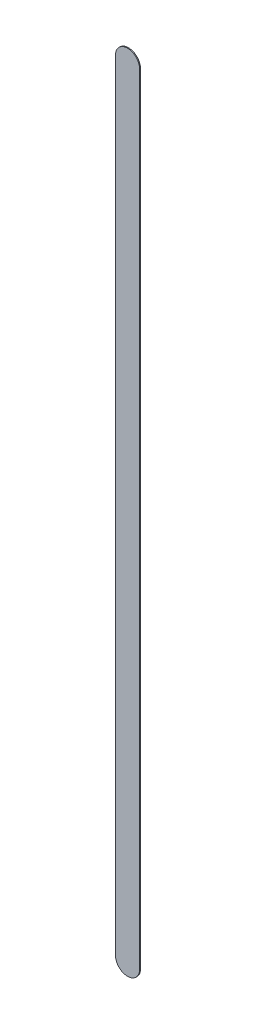
ISO-10303-21;
HEADER;
FILE_DESCRIPTION(('STEP AP214'),'2;1');
FILE_NAME('part.step','',(''),(''),'','','');
FILE_SCHEMA(('AUTOMOTIVE_DESIGN { 1 0 10303 214 1 1 1 1 }'));
ENDSEC;
DATA;
#1=APPLICATION_CONTEXT('core data for automotive mechanical design processes');
#2=APPLICATION_PROTOCOL_DEFINITION('international standard','automotive_design',2000,#1);
#3=PRODUCT_CONTEXT('',#1,'mechanical');
#4=PRODUCT('Part','Part','',(#3));
#5=PRODUCT_RELATED_PRODUCT_CATEGORY('part','',(#4));
#6=PRODUCT_DEFINITION_FORMATION('','',#4);
#7=PRODUCT_DEFINITION_CONTEXT('part definition',#1,'design');
#8=PRODUCT_DEFINITION('design','',#6,#7);
#9=PRODUCT_DEFINITION_SHAPE('','',#8);
#10=(LENGTH_UNIT() NAMED_UNIT(*) SI_UNIT(.MILLI.,.METRE.));
#11=(NAMED_UNIT(*) PLANE_ANGLE_UNIT() SI_UNIT($,.RADIAN.));
#12=(NAMED_UNIT(*) SI_UNIT($,.STERADIAN.) SOLID_ANGLE_UNIT());
#13=UNCERTAINTY_MEASURE_WITH_UNIT(LENGTH_MEASURE(1.E-05),#10,'distance_accuracy_value','');
#14=(GEOMETRIC_REPRESENTATION_CONTEXT(3) GLOBAL_UNCERTAINTY_ASSIGNED_CONTEXT((#13)) GLOBAL_UNIT_ASSIGNED_CONTEXT((#10,
#11,#12)) REPRESENTATION_CONTEXT('',''));
#15=CARTESIAN_POINT('',(0.,0.,0.));
#16=DIRECTION('',(0.,0.,1.));
#17=DIRECTION('',(1.,0.,0.));
#18=AXIS2_PLACEMENT_3D('',#15,#16,#17);
#19=CARTESIAN_POINT('',(42.89999802,78.99999948,0.));
#20=DIRECTION('',(-1.,0.,0.));
#21=DIRECTION('',(0.,1.,0.));
#22=AXIS2_PLACEMENT_3D('',#19,#20,#21);
#23=PLANE('',#22);
#24=DIRECTION('',(0.,1.,0.));
#25=VECTOR('',#24,1.);
#26=CARTESIAN_POINT('',(42.89999802,78.99999948,0.03556));
#27=LINE('',#26,#25);
#28=CARTESIAN_POINT('',(42.89999802,78.99999948,0.03556));
#29=VERTEX_POINT('',#28);
#30=CARTESIAN_POINT('',(42.89999802,111.31700622,0.03556));
#31=VERTEX_POINT('',#30);
#32=EDGE_CURVE('E11',#29,#31,#27,.T.);
#33=ORIENTED_EDGE('',*,*,#32,.F.);
#34=DIRECTION('',(0.,0.,1.));
#35=VECTOR('',#34,1.);
#36=CARTESIAN_POINT('',(42.89999802,78.99999948,0.));
#37=LINE('',#36,#35);
#38=CARTESIAN_POINT('',(42.89999802,78.99999948,0.));
#39=VERTEX_POINT('',#38);
#40=EDGE_CURVE('E24',#39,#29,#37,.T.);
#41=ORIENTED_EDGE('',*,*,#40,.F.);
#42=DIRECTION('',(0.,1.,0.));
#43=VECTOR('',#42,1.);
#44=CARTESIAN_POINT('',(42.89999802,78.99999948,0.));
#45=LINE('',#44,#43);
#46=CARTESIAN_POINT('',(42.89999802,111.31700622,0.));
#47=VERTEX_POINT('',#46);
#48=EDGE_CURVE('E75',#39,#47,#45,.T.);
#49=ORIENTED_EDGE('',*,*,#48,.T.);
#50=DIRECTION('',(0.,0.,1.));
#51=VECTOR('',#50,1.);
#52=CARTESIAN_POINT('',(42.89999802,111.31700622,0.));
#53=LINE('',#52,#51);
#54=EDGE_CURVE('E37',#47,#31,#53,.T.);
#55=ORIENTED_EDGE('',*,*,#54,.T.);
#56=EDGE_LOOP('',(#33,#41,#49,#55));
#57=FACE_BOUND('',#56,.T.);
#58=ADVANCED_FACE('F17',(#57),#23,.F.);
#59=CARTESIAN_POINT('',(42.39999902,111.31700622,0.));
#60=DIRECTION('',(0.,0.,-1.));
#61=DIRECTION('',(1.,0.,0.));
#62=AXIS2_PLACEMENT_3D('',#59,#60,#61);
#63=CYLINDRICAL_SURFACE('',#62,0.499999);
#64=CARTESIAN_POINT('',(42.39999902,111.31700622,0.03556));
#65=DIRECTION('',(0.,0.,1.));
#66=DIRECTION('',(1.,0.,0.));
#67=AXIS2_PLACEMENT_3D('',#64,#65,#66);
#68=CIRCLE('',#67,0.499999);
#69=CARTESIAN_POINT('',(41.90000002,111.31700622,0.03556));
#70=VERTEX_POINT('',#69);
#71=EDGE_CURVE('E83',#31,#70,#68,.T.);
#72=ORIENTED_EDGE('',*,*,#71,.F.);
#73=ORIENTED_EDGE('',*,*,#54,.F.);
#74=CARTESIAN_POINT('',(42.39999902,111.31700622,0.));
#75=DIRECTION('',(0.,0.,1.));
#76=DIRECTION('',(1.,0.,0.));
#77=AXIS2_PLACEMENT_3D('',#74,#75,#76);
#78=CIRCLE('',#77,0.499999);
#79=CARTESIAN_POINT('',(41.90000002,111.31700622,0.));
#80=VERTEX_POINT('',#79);
#81=EDGE_CURVE('E81',#47,#80,#78,.T.);
#82=ORIENTED_EDGE('',*,*,#81,.T.);
#83=DIRECTION('',(0.,0.,1.));
#84=VECTOR('',#83,1.);
#85=CARTESIAN_POINT('',(41.90000002,111.31700622,0.));
#86=LINE('',#85,#84);
#87=EDGE_CURVE('E67',#80,#70,#86,.T.);
#88=ORIENTED_EDGE('',*,*,#87,.T.);
#89=EDGE_LOOP('',(#72,#73,#82,#88));
#90=FACE_BOUND('',#89,.T.);
#91=ADVANCED_FACE('F89',(#90),#63,.T.);
#92=CARTESIAN_POINT('',(41.90000002,111.31700622,0.));
#93=DIRECTION('',(1.,0.,0.));
#94=DIRECTION('',(0.,-1.,0.));
#95=AXIS2_PLACEMENT_3D('',#92,#93,#94);
#96=PLANE('',#95);
#97=DIRECTION('',(0.,-1.,0.));
#98=VECTOR('',#97,1.);
#99=CARTESIAN_POINT('',(41.90000002,111.31700622,0.03556));
#100=LINE('',#99,#98);
#101=CARTESIAN_POINT('',(41.90000002,78.99999948,0.03556));
#102=VERTEX_POINT('',#101);
#103=EDGE_CURVE('E71',#70,#102,#100,.T.);
#104=ORIENTED_EDGE('',*,*,#103,.F.);
#105=ORIENTED_EDGE('',*,*,#87,.F.);
#106=DIRECTION('',(0.,-1.,0.));
#107=VECTOR('',#106,1.);
#108=CARTESIAN_POINT('',(41.90000002,111.31700622,0.));
#109=LINE('',#108,#107);
#110=CARTESIAN_POINT('',(41.90000002,78.99999948,0.));
#111=VERTEX_POINT('',#110);
#112=EDGE_CURVE('E63',#80,#111,#109,.T.);
#113=ORIENTED_EDGE('',*,*,#112,.T.);
#114=DIRECTION('',(0.,0.,1.));
#115=VECTOR('',#114,1.);
#116=CARTESIAN_POINT('',(41.90000002,78.99999948,0.));
#117=LINE('',#116,#115);
#118=EDGE_CURVE('E53',#111,#102,#117,.T.);
#119=ORIENTED_EDGE('',*,*,#118,.T.);
#120=EDGE_LOOP('',(#104,#105,#113,#119));
#121=FACE_BOUND('',#120,.T.);
#122=ADVANCED_FACE('F66',(#121),#96,.F.);
#123=CARTESIAN_POINT('',(42.39999902,78.99999948,0.));
#124=DIRECTION('',(0.,0.,-1.));
#125=DIRECTION('',(-1.,0.,0.));
#126=AXIS2_PLACEMENT_3D('',#123,#124,#125);
#127=CYLINDRICAL_SURFACE('',#126,0.499999);
#128=CARTESIAN_POINT('',(42.39999902,78.99999948,0.03556));
#129=DIRECTION('',(0.,0.,1.));
#130=DIRECTION('',(-1.,0.,0.));
#131=AXIS2_PLACEMENT_3D('',#128,#129,#130);
#132=CIRCLE('',#131,0.499999);
#133=EDGE_CURVE('E59',#102,#29,#132,.T.);
#134=ORIENTED_EDGE('',*,*,#133,.F.);
#135=ORIENTED_EDGE('',*,*,#118,.F.);
#136=CARTESIAN_POINT('',(42.39999902,78.99999948,0.));
#137=DIRECTION('',(0.,0.,1.));
#138=DIRECTION('',(-1.,0.,0.));
#139=AXIS2_PLACEMENT_3D('',#136,#137,#138);
#140=CIRCLE('',#139,0.499999);
#141=EDGE_CURVE('E57',#111,#39,#140,.T.);
#142=ORIENTED_EDGE('',*,*,#141,.T.);
#143=ORIENTED_EDGE('',*,*,#40,.T.);
#144=EDGE_LOOP('',(#134,#135,#142,#143));
#145=FACE_BOUND('',#144,.T.);
#146=ADVANCED_FACE('F55',(#145),#127,.T.);
#147=CARTESIAN_POINT('',(42.89999802,78.99999948,0.));
#148=DIRECTION('',(0.,0.,-1.));
#149=DIRECTION('',(-1.,0.,0.));
#150=AXIS2_PLACEMENT_3D('',#147,#148,#149);
#151=PLANE('',#150);
#152=ORIENTED_EDGE('',*,*,#141,.F.);
#153=ORIENTED_EDGE('',*,*,#112,.F.);
#154=ORIENTED_EDGE('',*,*,#81,.F.);
#155=ORIENTED_EDGE('',*,*,#48,.F.);
#156=EDGE_LOOP('',(#152,#153,#154,#155));
#157=FACE_BOUND('',#156,.T.);
#158=ADVANCED_FACE('F74',(#157),#151,.T.);
#159=CARTESIAN_POINT('',(42.89999802,78.99999948,0.03556));
#160=DIRECTION('',(0.,0.,-1.));
#161=DIRECTION('',(-1.,0.,0.));
#162=AXIS2_PLACEMENT_3D('',#159,#160,#161);
#163=PLANE('',#162);
#164=ORIENTED_EDGE('',*,*,#32,.T.);
#165=ORIENTED_EDGE('',*,*,#71,.T.);
#166=ORIENTED_EDGE('',*,*,#103,.T.);
#167=ORIENTED_EDGE('',*,*,#133,.T.);
#168=EDGE_LOOP('',(#164,#165,#166,#167));
#169=FACE_BOUND('',#168,.T.);
#170=ADVANCED_FACE('F91',(#169),#163,.F.);
#171=CLOSED_SHELL('',(#58,#91,#122,#146,#158,#170));
#172=MANIFOLD_SOLID_BREP('B1',#171);
#173=ADVANCED_BREP_SHAPE_REPRESENTATION('',(#18,#172),#14);
#174=SHAPE_DEFINITION_REPRESENTATION(#9,#173);
ENDSEC;
END-ISO-10303-21;
